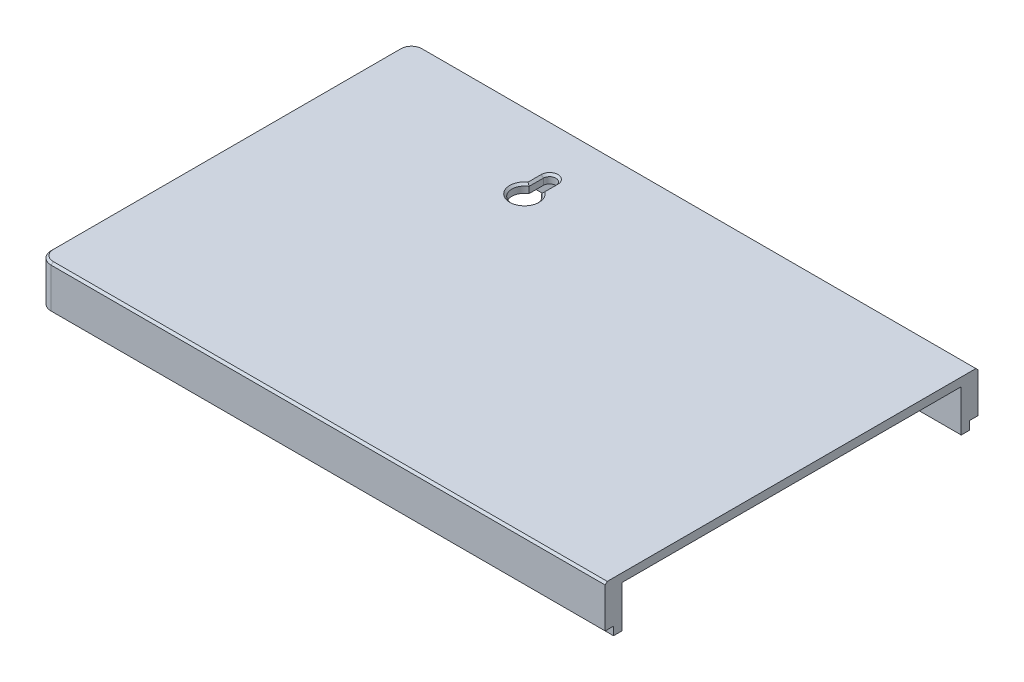
ISO-10303-21;
HEADER;
FILE_DESCRIPTION(('STEP AP214'),'2;1');
FILE_NAME('part.step','',(''),(''),'','','');
FILE_SCHEMA(('AUTOMOTIVE_DESIGN { 1 0 10303 214 1 1 1 1 }'));
ENDSEC;
DATA;
#1=APPLICATION_CONTEXT('core data for automotive mechanical design processes');
#2=APPLICATION_PROTOCOL_DEFINITION('international standard','automotive_design',2000,#1);
#3=PRODUCT_CONTEXT('',#1,'mechanical');
#4=PRODUCT('Part','Part','',(#3));
#5=PRODUCT_RELATED_PRODUCT_CATEGORY('part','',(#4));
#6=PRODUCT_DEFINITION_FORMATION('','',#4);
#7=PRODUCT_DEFINITION_CONTEXT('part definition',#1,'design');
#8=PRODUCT_DEFINITION('design','',#6,#7);
#9=PRODUCT_DEFINITION_SHAPE('','',#8);
#10=(LENGTH_UNIT() NAMED_UNIT(*) SI_UNIT(.MILLI.,.METRE.));
#11=(NAMED_UNIT(*) PLANE_ANGLE_UNIT() SI_UNIT($,.RADIAN.));
#12=(NAMED_UNIT(*) SI_UNIT($,.STERADIAN.) SOLID_ANGLE_UNIT());
#13=UNCERTAINTY_MEASURE_WITH_UNIT(LENGTH_MEASURE(1.E-05),#10,'distance_accuracy_value','');
#14=(GEOMETRIC_REPRESENTATION_CONTEXT(3) GLOBAL_UNCERTAINTY_ASSIGNED_CONTEXT((#13)) GLOBAL_UNIT_ASSIGNED_CONTEXT((#10,
#11,#12)) REPRESENTATION_CONTEXT('',''));
#15=CARTESIAN_POINT('',(0.,0.,0.));
#16=DIRECTION('',(0.,0.,1.));
#17=DIRECTION('',(1.,0.,0.));
#18=AXIS2_PLACEMENT_3D('',#15,#16,#17);
#19=CARTESIAN_POINT('',(-163.25,10.,42.5));
#20=DIRECTION('',(0.,0.,-1.));
#21=DIRECTION('',(-1.,0.,0.));
#22=AXIS2_PLACEMENT_3D('',#19,#20,#21);
#23=PLANE('',#22);
#24=DIRECTION('',(1.,0.,0.));
#25=VECTOR('',#24,1.);
#26=CARTESIAN_POINT('',(-163.25,0.,42.5));
#27=LINE('',#26,#25);
#28=CARTESIAN_POINT('',(-161.25,0.,42.5));
#29=VERTEX_POINT('',#28);
#30=CARTESIAN_POINT('',(-30.0054714408186,0.,42.5));
#31=VERTEX_POINT('',#30);
#32=EDGE_CURVE('E258',#29,#31,#27,.T.);
#33=ORIENTED_EDGE('',*,*,#32,.T.);
#34=DIRECTION('',(0.,1.,0.));
#35=VECTOR('',#34,1.);
#36=CARTESIAN_POINT('',(-30.0054714408186,10.,42.5));
#37=LINE('',#36,#35);
#38=CARTESIAN_POINT('',(-30.0054714408186,2.,42.5));
#39=VERTEX_POINT('',#38);
#40=EDGE_CURVE('E660',#31,#39,#37,.T.);
#41=ORIENTED_EDGE('',*,*,#40,.T.);
#42=DIRECTION('',(1.,0.,0.));
#43=VECTOR('',#42,1.);
#44=CARTESIAN_POINT('',(-163.25,2.,42.5));
#45=LINE('',#44,#43);
#46=CARTESIAN_POINT('',(-161.25,2.,42.5));
#47=VERTEX_POINT('',#46);
#48=EDGE_CURVE('E501',#47,#39,#45,.T.);
#49=ORIENTED_EDGE('',*,*,#48,.F.);
#50=DIRECTION('',(0.,-1.,0.));
#51=VECTOR('',#50,1.);
#52=CARTESIAN_POINT('',(-161.25,10.,42.5));
#53=LINE('',#52,#51);
#54=EDGE_CURVE('E312',#47,#29,#53,.T.);
#55=ORIENTED_EDGE('',*,*,#54,.T.);
#56=EDGE_LOOP('',(#33,#41,#49,#55));
#57=FACE_BOUND('',#56,.T.);
#58=ADVANCED_FACE('F43',(#57),#23,.F.);
#59=CARTESIAN_POINT('',(-163.25,10.,-42.5));
#60=DIRECTION('',(0.,0.,1.));
#61=DIRECTION('',(1.,0.,0.));
#62=AXIS2_PLACEMENT_3D('',#59,#60,#61);
#63=PLANE('',#62);
#64=DIRECTION('',(-1.,0.,0.));
#65=VECTOR('',#64,1.);
#66=CARTESIAN_POINT('',(-163.25,2.,-42.5));
#67=LINE('',#66,#65);
#68=CARTESIAN_POINT('',(-30.0054714408186,2.,-42.5));
#69=VERTEX_POINT('',#68);
#70=CARTESIAN_POINT('',(-161.25,2.,-42.5));
#71=VERTEX_POINT('',#70);
#72=EDGE_CURVE('E242',#69,#71,#67,.T.);
#73=ORIENTED_EDGE('',*,*,#72,.F.);
#74=DIRECTION('',(0.,-1.,0.));
#75=VECTOR('',#74,1.);
#76=CARTESIAN_POINT('',(-30.0054714408186,10.,-42.5));
#77=LINE('',#76,#75);
#78=CARTESIAN_POINT('',(-30.0054714408186,0.,-42.5));
#79=VERTEX_POINT('',#78);
#80=EDGE_CURVE('E225',#69,#79,#77,.T.);
#81=ORIENTED_EDGE('',*,*,#80,.T.);
#82=DIRECTION('',(-1.,0.,0.));
#83=VECTOR('',#82,1.);
#84=CARTESIAN_POINT('',(-163.25,0.,-42.5));
#85=LINE('',#84,#83);
#86=CARTESIAN_POINT('',(-161.25,0.,-42.5));
#87=VERTEX_POINT('',#86);
#88=EDGE_CURVE('E240',#79,#87,#85,.T.);
#89=ORIENTED_EDGE('',*,*,#88,.T.);
#90=DIRECTION('',(0.,-1.,0.));
#91=VECTOR('',#90,1.);
#92=CARTESIAN_POINT('',(-161.25,10.,-42.5));
#93=LINE('',#92,#91);
#94=EDGE_CURVE('E309',#87,#71,#93,.F.);
#95=ORIENTED_EDGE('',*,*,#94,.T.);
#96=EDGE_LOOP('',(#73,#81,#89,#95));
#97=FACE_BOUND('',#96,.T.);
#98=ADVANCED_FACE('F238',(#97),#63,.F.);
#99=CARTESIAN_POINT('',(-163.25,10.,-42.5));
#100=DIRECTION('',(1.,0.,0.));
#101=DIRECTION('',(0.,0.,-1.));
#102=AXIS2_PLACEMENT_3D('',#99,#100,#101);
#103=PLANE('',#102);
#104=DIRECTION('',(0.,0.,1.));
#105=VECTOR('',#104,1.);
#106=CARTESIAN_POINT('',(-163.25,2.,-42.5));
#107=LINE('',#106,#105);
#108=CARTESIAN_POINT('',(-163.25,2.,-40.5));
#109=VERTEX_POINT('',#108);
#110=CARTESIAN_POINT('',(-163.25,2.,40.5));
#111=VERTEX_POINT('',#110);
#112=EDGE_CURVE('E505',#109,#111,#107,.T.);
#113=ORIENTED_EDGE('',*,*,#112,.F.);
#114=DIRECTION('',(0.,-1.,0.));
#115=VECTOR('',#114,1.);
#116=CARTESIAN_POINT('',(-163.25,10.,-40.5));
#117=LINE('',#116,#115);
#118=CARTESIAN_POINT('',(-163.25,0.,-40.5));
#119=VERTEX_POINT('',#118);
#120=EDGE_CURVE('E300',#109,#119,#117,.T.);
#121=ORIENTED_EDGE('',*,*,#120,.T.);
#122=DIRECTION('',(0.,0.,1.));
#123=VECTOR('',#122,1.);
#124=CARTESIAN_POINT('',(-163.25,0.,-42.5));
#125=LINE('',#124,#123);
#126=CARTESIAN_POINT('',(-163.25,0.,40.5));
#127=VERTEX_POINT('',#126);
#128=EDGE_CURVE('E252',#119,#127,#125,.T.);
#129=ORIENTED_EDGE('',*,*,#128,.T.);
#130=DIRECTION('',(0.,-1.,0.));
#131=VECTOR('',#130,1.);
#132=CARTESIAN_POINT('',(-163.25,10.,40.5));
#133=LINE('',#132,#131);
#134=EDGE_CURVE('E297',#127,#111,#133,.F.);
#135=ORIENTED_EDGE('',*,*,#134,.T.);
#136=EDGE_LOOP('',(#113,#121,#129,#135));
#137=FACE_BOUND('',#136,.T.);
#138=ADVANCED_FACE('F588',(#137),#103,.F.);
#139=CARTESIAN_POINT('',(0.,0.,0.));
#140=DIRECTION('',(0.,1.,0.));
#141=DIRECTION('',(0.,0.,1.));
#142=AXIS2_PLACEMENT_3D('',#139,#140,#141);
#143=PLANE('',#142);
#144=ORIENTED_EDGE('',*,*,#88,.F.);
#145=DIRECTION('',(0.,0.,1.));
#146=VECTOR('',#145,1.);
#147=CARTESIAN_POINT('',(-30.0054714408186,0.,-62.2613570422331));
#148=LINE('',#147,#146);
#149=CARTESIAN_POINT('',(-30.0054714408186,0.,-40.5));
#150=VERTEX_POINT('',#149);
#151=EDGE_CURVE('E222',#79,#150,#148,.T.);
#152=ORIENTED_EDGE('',*,*,#151,.T.);
#153=DIRECTION('',(-1.,0.,0.));
#154=VECTOR('',#153,1.);
#155=CARTESIAN_POINT('',(-161.25,0.,-40.5));
#156=LINE('',#155,#154);
#157=CARTESIAN_POINT('',(-158.25,0.,-40.5));
#158=VERTEX_POINT('',#157);
#159=EDGE_CURVE('E511',#150,#158,#156,.T.);
#160=ORIENTED_EDGE('',*,*,#159,.T.);
#161=CARTESIAN_POINT('',(-158.25,0.,-37.5));
#162=DIRECTION('',(0.,1.,0.));
#163=DIRECTION('',(0.,0.,1.));
#164=AXIS2_PLACEMENT_3D('',#161,#162,#163);
#165=CIRCLE('',#164,3.);
#166=CARTESIAN_POINT('',(-161.25,0.,-37.5));
#167=VERTEX_POINT('',#166);
#168=EDGE_CURVE('E291',#158,#167,#165,.T.);
#169=ORIENTED_EDGE('',*,*,#168,.T.);
#170=DIRECTION('',(0.,0.,1.));
#171=VECTOR('',#170,1.);
#172=CARTESIAN_POINT('',(-161.25,0.,-40.5));
#173=LINE('',#172,#171);
#174=CARTESIAN_POINT('',(-161.25,0.,37.5));
#175=VERTEX_POINT('',#174);
#176=EDGE_CURVE('E519',#167,#175,#173,.T.);
#177=ORIENTED_EDGE('',*,*,#176,.T.);
#178=CARTESIAN_POINT('',(-158.25,0.,37.5));
#179=DIRECTION('',(0.,1.,0.));
#180=DIRECTION('',(0.,0.,1.));
#181=AXIS2_PLACEMENT_3D('',#178,#179,#180);
#182=CIRCLE('',#181,3.);
#183=CARTESIAN_POINT('',(-158.25,0.,40.5));
#184=VERTEX_POINT('',#183);
#185=EDGE_CURVE('E294',#175,#184,#182,.T.);
#186=ORIENTED_EDGE('',*,*,#185,.T.);
#187=DIRECTION('',(1.,0.,0.));
#188=VECTOR('',#187,1.);
#189=CARTESIAN_POINT('',(-161.25,0.,40.5));
#190=LINE('',#189,#188);
#191=CARTESIAN_POINT('',(-30.0054714408186,0.,40.5));
#192=VERTEX_POINT('',#191);
#193=EDGE_CURVE('E264',#184,#192,#190,.T.);
#194=ORIENTED_EDGE('',*,*,#193,.T.);
#195=EDGE_CURVE('E234',#192,#31,#148,.T.);
#196=ORIENTED_EDGE('',*,*,#195,.T.);
#197=ORIENTED_EDGE('',*,*,#32,.F.);
#198=CARTESIAN_POINT('',(-161.25,0.,40.5));
#199=DIRECTION('',(0.,1.,0.));
#200=DIRECTION('',(0.,0.,1.));
#201=AXIS2_PLACEMENT_3D('',#198,#199,#200);
#202=CIRCLE('',#201,2.);
#203=EDGE_CURVE('E304',#29,#127,#202,.F.);
#204=ORIENTED_EDGE('',*,*,#203,.T.);
#205=ORIENTED_EDGE('',*,*,#128,.F.);
#206=CARTESIAN_POINT('',(-161.25,0.,-40.5));
#207=DIRECTION('',(0.,1.,0.));
#208=DIRECTION('',(0.,0.,1.));
#209=AXIS2_PLACEMENT_3D('',#206,#207,#208);
#210=CIRCLE('',#209,2.);
#211=EDGE_CURVE('E249',#119,#87,#210,.F.);
#212=ORIENTED_EDGE('',*,*,#211,.T.);
#213=EDGE_LOOP('',(#144,#152,#160,#169,#177,#186,#194,#196,#197,#204,#205,#212));
#214=FACE_BOUND('',#213,.T.);
#215=ADVANCED_FACE('F247',(#214),#143,.F.);
#216=CARTESIAN_POINT('',(-161.25,10.,-40.5));
#217=DIRECTION('',(0.,0.,1.));
#218=DIRECTION('',(1.,0.,0.));
#219=AXIS2_PLACEMENT_3D('',#216,#217,#218);
#220=PLANE('',#219);
#221=DIRECTION('',(0.,-1.,0.));
#222=VECTOR('',#221,1.);
#223=CARTESIAN_POINT('',(-30.0054714408186,10.,-40.5));
#224=LINE('',#223,#222);
#225=CARTESIAN_POINT('',(-30.0054714408186,10.,-40.5));
#226=VERTEX_POINT('',#225);
#227=EDGE_CURVE('E228',#226,#150,#224,.T.);
#228=ORIENTED_EDGE('',*,*,#227,.F.);
#229=DIRECTION('',(-1.,0.,0.));
#230=VECTOR('',#229,1.);
#231=CARTESIAN_POINT('',(-161.25,10.,-40.5));
#232=LINE('',#231,#230);
#233=CARTESIAN_POINT('',(-158.25,10.,-40.5));
#234=VERTEX_POINT('',#233);
#235=EDGE_CURVE('E512',#226,#234,#232,.T.);
#236=ORIENTED_EDGE('',*,*,#235,.T.);
#237=DIRECTION('',(0.,-1.,0.));
#238=VECTOR('',#237,1.);
#239=CARTESIAN_POINT('',(-158.25,0.,-40.5));
#240=LINE('',#239,#238);
#241=EDGE_CURVE('E270',#234,#158,#240,.T.);
#242=ORIENTED_EDGE('',*,*,#241,.T.);
#243=ORIENTED_EDGE('',*,*,#159,.F.);
#244=EDGE_LOOP('',(#228,#236,#242,#243));
#245=FACE_BOUND('',#244,.T.);
#246=ADVANCED_FACE('F552',(#245),#220,.T.);
#247=CARTESIAN_POINT('',(-161.25,10.,-40.5));
#248=DIRECTION('',(1.,0.,0.));
#249=DIRECTION('',(0.,0.,-1.));
#250=AXIS2_PLACEMENT_3D('',#247,#248,#249);
#251=PLANE('',#250);
#252=ORIENTED_EDGE('',*,*,#176,.F.);
#253=DIRECTION('',(0.,-1.,0.));
#254=VECTOR('',#253,1.);
#255=CARTESIAN_POINT('',(-161.25,10.,-37.5));
#256=LINE('',#255,#254);
#257=CARTESIAN_POINT('',(-161.25,10.,-37.5));
#258=VERTEX_POINT('',#257);
#259=EDGE_CURVE('E278',#167,#258,#256,.F.);
#260=ORIENTED_EDGE('',*,*,#259,.T.);
#261=DIRECTION('',(0.,0.,1.));
#262=VECTOR('',#261,1.);
#263=CARTESIAN_POINT('',(-161.25,10.,-40.5));
#264=LINE('',#263,#262);
#265=CARTESIAN_POINT('',(-161.25,10.,37.5));
#266=VERTEX_POINT('',#265);
#267=EDGE_CURVE('E261',#258,#266,#264,.T.);
#268=ORIENTED_EDGE('',*,*,#267,.T.);
#269=DIRECTION('',(0.,-1.,0.));
#270=VECTOR('',#269,1.);
#271=CARTESIAN_POINT('',(-161.25,0.,37.5));
#272=LINE('',#271,#270);
#273=EDGE_CURVE('E274',#266,#175,#272,.T.);
#274=ORIENTED_EDGE('',*,*,#273,.T.);
#275=EDGE_LOOP('',(#252,#260,#268,#274));
#276=FACE_BOUND('',#275,.T.);
#277=ADVANCED_FACE('F545',(#276),#251,.T.);
#278=CARTESIAN_POINT('',(-161.25,10.,40.5));
#279=DIRECTION('',(0.,0.,-1.));
#280=DIRECTION('',(-1.,0.,0.));
#281=AXIS2_PLACEMENT_3D('',#278,#279,#280);
#282=PLANE('',#281);
#283=DIRECTION('',(0.,1.,0.));
#284=VECTOR('',#283,1.);
#285=CARTESIAN_POINT('',(-30.0054714408186,10.,40.5));
#286=LINE('',#285,#284);
#287=CARTESIAN_POINT('',(-30.0054714408186,10.,40.5));
#288=VERTEX_POINT('',#287);
#289=EDGE_CURVE('E533',#192,#288,#286,.T.);
#290=ORIENTED_EDGE('',*,*,#289,.F.);
#291=ORIENTED_EDGE('',*,*,#193,.F.);
#292=DIRECTION('',(0.,-1.,0.));
#293=VECTOR('',#292,1.);
#294=CARTESIAN_POINT('',(-158.25,10.,40.5));
#295=LINE('',#294,#293);
#296=CARTESIAN_POINT('',(-158.25,10.,40.5));
#297=VERTEX_POINT('',#296);
#298=EDGE_CURVE('E288',#184,#297,#295,.F.);
#299=ORIENTED_EDGE('',*,*,#298,.T.);
#300=DIRECTION('',(1.,0.,0.));
#301=VECTOR('',#300,1.);
#302=CARTESIAN_POINT('',(-161.25,10.,40.5));
#303=LINE('',#302,#301);
#304=EDGE_CURVE('E253',#297,#288,#303,.T.);
#305=ORIENTED_EDGE('',*,*,#304,.T.);
#306=EDGE_LOOP('',(#290,#291,#299,#305));
#307=FACE_BOUND('',#306,.T.);
#308=ADVANCED_FACE('F531',(#307),#282,.T.);
#309=CARTESIAN_POINT('',(0.,2.,0.));
#310=DIRECTION('',(0.,1.,0.));
#311=DIRECTION('',(0.,0.,1.));
#312=AXIS2_PLACEMENT_3D('',#309,#310,#311);
#313=PLANE('',#312);
#314=DIRECTION('',(-1.,0.,0.));
#315=VECTOR('',#314,1.);
#316=CARTESIAN_POINT('',(-165.25,2.,-44.5));
#317=LINE('',#316,#315);
#318=CARTESIAN_POINT('',(-30.0054714408186,2.,-44.5));
#319=VERTEX_POINT('',#318);
#320=CARTESIAN_POINT('',(-162.25,2.,-44.5));
#321=VERTEX_POINT('',#320);
#322=EDGE_CURVE('E393',#319,#321,#317,.T.);
#323=ORIENTED_EDGE('',*,*,#322,.F.);
#324=DIRECTION('',(0.,0.,1.));
#325=VECTOR('',#324,1.);
#326=CARTESIAN_POINT('',(-30.0054714408186,2.,0.));
#327=LINE('',#326,#325);
#328=EDGE_CURVE('E245',#319,#69,#327,.T.);
#329=ORIENTED_EDGE('',*,*,#328,.T.);
#330=ORIENTED_EDGE('',*,*,#72,.T.);
#331=CARTESIAN_POINT('',(-161.25,2.,-40.5));
#332=DIRECTION('',(0.,1.,0.));
#333=DIRECTION('',(0.,0.,1.));
#334=AXIS2_PLACEMENT_3D('',#331,#332,#333);
#335=CIRCLE('',#334,2.);
#336=EDGE_CURVE('E316',#71,#109,#335,.T.);
#337=ORIENTED_EDGE('',*,*,#336,.T.);
#338=ORIENTED_EDGE('',*,*,#112,.T.);
#339=CARTESIAN_POINT('',(-161.25,2.,40.5));
#340=DIRECTION('',(0.,1.,0.));
#341=DIRECTION('',(0.,0.,1.));
#342=AXIS2_PLACEMENT_3D('',#339,#340,#341);
#343=CIRCLE('',#342,2.);
#344=EDGE_CURVE('E319',#111,#47,#343,.T.);
#345=ORIENTED_EDGE('',*,*,#344,.T.);
#346=ORIENTED_EDGE('',*,*,#48,.T.);
#347=CARTESIAN_POINT('',(-30.0054714408186,2.,44.5));
#348=VERTEX_POINT('',#347);
#349=EDGE_CURVE('E685',#39,#348,#327,.T.);
#350=ORIENTED_EDGE('',*,*,#349,.T.);
#351=DIRECTION('',(1.,0.,0.));
#352=VECTOR('',#351,1.);
#353=CARTESIAN_POINT('',(-165.25,2.,44.5));
#354=LINE('',#353,#352);
#355=CARTESIAN_POINT('',(-162.25,2.,44.5));
#356=VERTEX_POINT('',#355);
#357=EDGE_CURVE('E497',#356,#348,#354,.T.);
#358=ORIENTED_EDGE('',*,*,#357,.F.);
#359=CARTESIAN_POINT('',(-162.25,2.,41.5));
#360=DIRECTION('',(0.,1.,0.));
#361=DIRECTION('',(0.,0.,1.));
#362=AXIS2_PLACEMENT_3D('',#359,#360,#361);
#363=CIRCLE('',#362,3.);
#364=CARTESIAN_POINT('',(-165.25,2.,41.5));
#365=VERTEX_POINT('',#364);
#366=EDGE_CURVE('E330',#356,#365,#363,.F.);
#367=ORIENTED_EDGE('',*,*,#366,.T.);
#368=DIRECTION('',(0.,0.,1.));
#369=VECTOR('',#368,1.);
#370=CARTESIAN_POINT('',(-165.25,2.,-44.5));
#371=LINE('',#370,#369);
#372=CARTESIAN_POINT('',(-165.25,2.,-41.5));
#373=VERTEX_POINT('',#372);
#374=EDGE_CURVE('E493',#373,#365,#371,.T.);
#375=ORIENTED_EDGE('',*,*,#374,.F.);
#376=CARTESIAN_POINT('',(-162.25,2.,-41.5));
#377=DIRECTION('',(0.,1.,0.));
#378=DIRECTION('',(0.,0.,1.));
#379=AXIS2_PLACEMENT_3D('',#376,#377,#378);
#380=CIRCLE('',#379,3.);
#381=EDGE_CURVE('E326',#373,#321,#380,.F.);
#382=ORIENTED_EDGE('',*,*,#381,.T.);
#383=EDGE_LOOP('',(#323,#329,#330,#337,#338,#345,#346,#350,#358,#367,#375,#382));
#384=FACE_BOUND('',#383,.T.);
#385=ADVANCED_FACE('F696',(#384),#313,.F.);
#386=CARTESIAN_POINT('',(-165.25,2.,44.5));
#387=DIRECTION('',(0.,0.,1.));
#388=DIRECTION('',(1.,0.,0.));
#389=AXIS2_PLACEMENT_3D('',#386,#387,#388);
#390=PLANE('',#389);
#391=DIRECTION('',(0.,-1.,0.));
#392=VECTOR('',#391,1.);
#393=CARTESIAN_POINT('',(-30.0054714408186,2.,44.5));
#394=LINE('',#393,#392);
#395=CARTESIAN_POINT('',(-30.0054714408186,11.5,44.5));
#396=VERTEX_POINT('',#395);
#397=EDGE_CURVE('E233',#396,#348,#394,.T.);
#398=ORIENTED_EDGE('',*,*,#397,.F.);
#399=DIRECTION('',(-1.,0.,0.));
#400=VECTOR('',#399,1.);
#401=CARTESIAN_POINT('',(-165.25,11.5,44.5));
#402=LINE('',#401,#400);
#403=CARTESIAN_POINT('',(-162.25,11.5,44.5));
#404=VERTEX_POINT('',#403);
#405=EDGE_CURVE('E359',#396,#404,#402,.T.);
#406=ORIENTED_EDGE('',*,*,#405,.T.);
#407=DIRECTION('',(0.,1.,0.));
#408=VECTOR('',#407,1.);
#409=CARTESIAN_POINT('',(-162.25,2.,44.5));
#410=LINE('',#409,#408);
#411=EDGE_CURVE('E333',#404,#356,#410,.F.);
#412=ORIENTED_EDGE('',*,*,#411,.T.);
#413=ORIENTED_EDGE('',*,*,#357,.T.);
#414=EDGE_LOOP('',(#398,#406,#412,#413));
#415=FACE_BOUND('',#414,.T.);
#416=ADVANCED_FACE('F708',(#415),#390,.T.);
#417=CARTESIAN_POINT('',(-165.25,2.,-44.5));
#418=DIRECTION('',(-1.,0.,0.));
#419=DIRECTION('',(0.,0.,1.));
#420=AXIS2_PLACEMENT_3D('',#417,#418,#419);
#421=PLANE('',#420);
#422=DIRECTION('',(0.,1.,0.));
#423=VECTOR('',#422,1.);
#424=CARTESIAN_POINT('',(-165.25,2.,41.5));
#425=LINE('',#424,#423);
#426=CARTESIAN_POINT('',(-165.25,11.5,41.5));
#427=VERTEX_POINT('',#426);
#428=EDGE_CURVE('E339',#365,#427,#425,.T.);
#429=ORIENTED_EDGE('',*,*,#428,.T.);
#430=DIRECTION('',(0.,0.,-1.));
#431=VECTOR('',#430,1.);
#432=CARTESIAN_POINT('',(-165.25,11.5,-44.5));
#433=LINE('',#432,#431);
#434=CARTESIAN_POINT('',(-165.25,11.5,-41.5));
#435=VERTEX_POINT('',#434);
#436=EDGE_CURVE('E365',#427,#435,#433,.T.);
#437=ORIENTED_EDGE('',*,*,#436,.T.);
#438=DIRECTION('',(0.,1.,0.));
#439=VECTOR('',#438,1.);
#440=CARTESIAN_POINT('',(-165.25,2.,-41.5));
#441=LINE('',#440,#439);
#442=EDGE_CURVE('E336',#435,#373,#441,.F.);
#443=ORIENTED_EDGE('',*,*,#442,.T.);
#444=ORIENTED_EDGE('',*,*,#374,.T.);
#445=EDGE_LOOP('',(#429,#437,#443,#444));
#446=FACE_BOUND('',#445,.T.);
#447=ADVANCED_FACE('F702',(#446),#421,.T.);
#448=CARTESIAN_POINT('',(-165.25,2.,-44.5));
#449=DIRECTION('',(0.,0.,-1.));
#450=DIRECTION('',(-1.,0.,0.));
#451=AXIS2_PLACEMENT_3D('',#448,#449,#450);
#452=PLANE('',#451);
#453=DIRECTION('',(0.,1.,0.));
#454=VECTOR('',#453,1.);
#455=CARTESIAN_POINT('',(-30.0054714408186,2.,-44.5));
#456=LINE('',#455,#454);
#457=CARTESIAN_POINT('',(-30.0054714408186,11.5,-44.5));
#458=VERTEX_POINT('',#457);
#459=EDGE_CURVE('E659',#319,#458,#456,.T.);
#460=ORIENTED_EDGE('',*,*,#459,.F.);
#461=ORIENTED_EDGE('',*,*,#322,.T.);
#462=DIRECTION('',(0.,1.,0.));
#463=VECTOR('',#462,1.);
#464=CARTESIAN_POINT('',(-162.25,2.,-44.5));
#465=LINE('',#464,#463);
#466=CARTESIAN_POINT('',(-162.25,11.5,-44.5));
#467=VERTEX_POINT('',#466);
#468=EDGE_CURVE('E322',#321,#467,#465,.T.);
#469=ORIENTED_EDGE('',*,*,#468,.T.);
#470=DIRECTION('',(1.,0.,0.));
#471=VECTOR('',#470,1.);
#472=CARTESIAN_POINT('',(-165.25,11.5,-44.5));
#473=LINE('',#472,#471);
#474=EDGE_CURVE('E371',#467,#458,#473,.T.);
#475=ORIENTED_EDGE('',*,*,#474,.T.);
#476=EDGE_LOOP('',(#460,#461,#469,#475));
#477=FACE_BOUND('',#476,.T.);
#478=ADVANCED_FACE('F664',(#477),#452,.T.);
#479=CARTESIAN_POINT('',(0.,10.,0.));
#480=DIRECTION('',(0.,1.,0.));
#481=DIRECTION('',(0.,0.,1.));
#482=AXIS2_PLACEMENT_3D('',#479,#480,#481);
#483=PLANE('',#482);
#484=DIRECTION('',(0.,0.,-1.));
#485=VECTOR('',#484,1.);
#486=CARTESIAN_POINT('',(-118.5,10.,0.));
#487=LINE('',#486,#485);
#488=CARTESIAN_POINT('',(-118.5,10.,-28.8207632967525));
#489=VERTEX_POINT('',#488);
#490=CARTESIAN_POINT('',(-118.5,10.,-32.2226870853992));
#491=VERTEX_POINT('',#490);
#492=EDGE_CURVE('E484',#489,#491,#487,.T.);
#493=ORIENTED_EDGE('',*,*,#492,.T.);
#494=CARTESIAN_POINT('',(-120.,10.,-32.2226870853992));
#495=DIRECTION('',(0.,1.,0.));
#496=DIRECTION('',(0.,0.,1.));
#497=AXIS2_PLACEMENT_3D('',#494,#495,#496);
#498=CIRCLE('',#497,1.5);
#499=CARTESIAN_POINT('',(-121.5,10.,-32.2226870853992));
#500=VERTEX_POINT('',#499);
#501=EDGE_CURVE('E381',#491,#500,#498,.T.);
#502=ORIENTED_EDGE('',*,*,#501,.T.);
#503=DIRECTION('',(0.,0.,1.));
#504=VECTOR('',#503,1.);
#505=CARTESIAN_POINT('',(-121.5,10.,0.));
#506=LINE('',#505,#504);
#507=CARTESIAN_POINT('',(-121.5,10.,-28.8207632967525));
#508=VERTEX_POINT('',#507);
#509=EDGE_CURVE('E475',#500,#508,#506,.T.);
#510=ORIENTED_EDGE('',*,*,#509,.T.);
#511=CARTESIAN_POINT('',(-120.,10.,-26.2226870853992));
#512=DIRECTION('',(0.,1.,0.));
#513=DIRECTION('',(0.,0.,1.));
#514=AXIS2_PLACEMENT_3D('',#511,#512,#513);
#515=CIRCLE('',#514,3.00000000000001);
#516=EDGE_CURVE('E479',#508,#489,#515,.T.);
#517=ORIENTED_EDGE('',*,*,#516,.T.);
#518=EDGE_LOOP('',(#493,#502,#510,#517));
#519=FACE_BOUND('',#518,.T.);
#520=ORIENTED_EDGE('',*,*,#235,.F.);
#521=DIRECTION('',(0.,0.,1.));
#522=VECTOR('',#521,1.);
#523=CARTESIAN_POINT('',(-30.0054714408186,10.,0.));
#524=LINE('',#523,#522);
#525=EDGE_CURVE('E244',#226,#288,#524,.T.);
#526=ORIENTED_EDGE('',*,*,#525,.T.);
#527=ORIENTED_EDGE('',*,*,#304,.F.);
#528=CARTESIAN_POINT('',(-158.25,10.,37.5));
#529=DIRECTION('',(0.,1.,0.));
#530=DIRECTION('',(0.,0.,1.));
#531=AXIS2_PLACEMENT_3D('',#528,#529,#530);
#532=CIRCLE('',#531,3.);
#533=EDGE_CURVE('E281',#297,#266,#532,.F.);
#534=ORIENTED_EDGE('',*,*,#533,.T.);
#535=ORIENTED_EDGE('',*,*,#267,.F.);
#536=CARTESIAN_POINT('',(-158.25,10.,-37.5));
#537=DIRECTION('',(0.,1.,0.));
#538=DIRECTION('',(0.,0.,1.));
#539=AXIS2_PLACEMENT_3D('',#536,#537,#538);
#540=CIRCLE('',#539,3.);
#541=EDGE_CURVE('E284',#258,#234,#540,.F.);
#542=ORIENTED_EDGE('',*,*,#541,.T.);
#543=EDGE_LOOP('',(#520,#526,#527,#534,#535,#542));
#544=FACE_BOUND('',#543,.T.);
#545=ADVANCED_FACE('F541',(#519,#544),#483,.F.);
#546=CARTESIAN_POINT('',(0.,12.,0.));
#547=DIRECTION('',(0.,1.,0.));
#548=DIRECTION('',(0.,0.,1.));
#549=AXIS2_PLACEMENT_3D('',#546,#547,#548);
#550=PLANE('',#549);
#551=DIRECTION('',(0.,0.,1.));
#552=VECTOR('',#551,1.);
#553=CARTESIAN_POINT('',(-30.0054714408186,12.,-62.2613570422331));
#554=LINE('',#553,#552);
#555=CARTESIAN_POINT('',(-30.0054714408186,12.,-44.));
#556=VERTEX_POINT('',#555);
#557=CARTESIAN_POINT('',(-30.0054714408186,12.,44.));
#558=VERTEX_POINT('',#557);
#559=EDGE_CURVE('E59',#556,#558,#554,.T.);
#560=ORIENTED_EDGE('',*,*,#559,.F.);
#561=DIRECTION('',(-1.,0.,0.));
#562=VECTOR('',#561,1.);
#563=CARTESIAN_POINT('',(0.,12.,-44.));
#564=LINE('',#563,#562);
#565=CARTESIAN_POINT('',(-162.25,12.,-44.));
#566=VERTEX_POINT('',#565);
#567=EDGE_CURVE('E343',#556,#566,#564,.T.);
#568=ORIENTED_EDGE('',*,*,#567,.T.);
#569=CARTESIAN_POINT('',(-162.25,12.,-41.5));
#570=DIRECTION('',(0.,1.,0.));
#571=DIRECTION('',(0.,0.,1.));
#572=AXIS2_PLACEMENT_3D('',#569,#570,#571);
#573=CIRCLE('',#572,2.49999999999997);
#574=CARTESIAN_POINT('',(-164.75,12.,-41.5));
#575=VERTEX_POINT('',#574);
#576=EDGE_CURVE('E346',#566,#575,#573,.T.);
#577=ORIENTED_EDGE('',*,*,#576,.T.);
#578=DIRECTION('',(0.,0.,1.));
#579=VECTOR('',#578,1.);
#580=CARTESIAN_POINT('',(-164.75,12.,0.));
#581=LINE('',#580,#579);
#582=CARTESIAN_POINT('',(-164.75,12.,41.5));
#583=VERTEX_POINT('',#582);
#584=EDGE_CURVE('E349',#575,#583,#581,.T.);
#585=ORIENTED_EDGE('',*,*,#584,.T.);
#586=CARTESIAN_POINT('',(-162.25,12.,41.5));
#587=DIRECTION('',(0.,1.,0.));
#588=DIRECTION('',(0.,0.,1.));
#589=AXIS2_PLACEMENT_3D('',#586,#587,#588);
#590=CIRCLE('',#589,2.49999999999997);
#591=CARTESIAN_POINT('',(-162.25,12.,44.));
#592=VERTEX_POINT('',#591);
#593=EDGE_CURVE('E352',#583,#592,#590,.T.);
#594=ORIENTED_EDGE('',*,*,#593,.T.);
#595=DIRECTION('',(1.,0.,0.));
#596=VECTOR('',#595,1.);
#597=CARTESIAN_POINT('',(0.,12.,44.));
#598=LINE('',#597,#596);
#599=EDGE_CURVE('E355',#592,#558,#598,.T.);
#600=ORIENTED_EDGE('',*,*,#599,.T.);
#601=EDGE_LOOP('',(#560,#568,#577,#585,#594,#600));
#602=FACE_BOUND('',#601,.T.);
#603=CARTESIAN_POINT('',(-120.,12.,-26.2226870853992));
#604=DIRECTION('',(0.,1.,0.));
#605=DIRECTION('',(0.,0.,1.));
#606=AXIS2_PLACEMENT_3D('',#603,#604,#605);
#607=CIRCLE('',#606,3.50000000000006);
#608=CARTESIAN_POINT('',(-118.,12.,-29.0949684086682));
#609=VERTEX_POINT('',#608);
#610=CARTESIAN_POINT('',(-122.,12.,-29.0949684086682));
#611=VERTEX_POINT('',#610);
#612=EDGE_CURVE('E375',#609,#611,#607,.F.);
#613=ORIENTED_EDGE('',*,*,#612,.T.);
#614=DIRECTION('',(0.,0.,-1.));
#615=VECTOR('',#614,1.);
#616=CARTESIAN_POINT('',(-122.,12.,-32.2226870853992));
#617=LINE('',#616,#615);
#618=CARTESIAN_POINT('',(-122.,12.,-32.2226870853992));
#619=VERTEX_POINT('',#618);
#620=EDGE_CURVE('E402',#611,#619,#617,.T.);
#621=ORIENTED_EDGE('',*,*,#620,.T.);
#622=CARTESIAN_POINT('',(-120.,12.,-32.2226870853992));
#623=DIRECTION('',(0.,1.,0.));
#624=DIRECTION('',(0.,0.,1.));
#625=AXIS2_PLACEMENT_3D('',#622,#623,#624);
#626=CIRCLE('',#625,2.00000000000006);
#627=CARTESIAN_POINT('',(-118.,12.,-32.2226870853992));
#628=VERTEX_POINT('',#627);
#629=EDGE_CURVE('E399',#619,#628,#626,.F.);
#630=ORIENTED_EDGE('',*,*,#629,.T.);
#631=DIRECTION('',(0.,0.,1.));
#632=VECTOR('',#631,1.);
#633=CARTESIAN_POINT('',(-118.,12.,-28.8207632967525));
#634=LINE('',#633,#632);
#635=EDGE_CURVE('E396',#628,#609,#634,.T.);
#636=ORIENTED_EDGE('',*,*,#635,.T.);
#637=EDGE_LOOP('',(#613,#621,#630,#636));
#638=FACE_BOUND('',#637,.T.);
#639=ADVANCED_FACE('F574',(#602,#638),#550,.T.);
#640=CARTESIAN_POINT('',(-158.25,10.,-37.5));
#641=DIRECTION('',(0.,1.,0.));
#642=DIRECTION('',(0.,0.,1.));
#643=AXIS2_PLACEMENT_3D('',#640,#641,#642);
#644=CYLINDRICAL_SURFACE('',#643,3.);
#645=ORIENTED_EDGE('',*,*,#541,.F.);
#646=ORIENTED_EDGE('',*,*,#259,.F.);
#647=ORIENTED_EDGE('',*,*,#168,.F.);
#648=ORIENTED_EDGE('',*,*,#241,.F.);
#649=EDGE_LOOP('',(#645,#646,#647,#648));
#650=FACE_BOUND('',#649,.T.);
#651=ADVANCED_FACE('F549',(#650),#644,.F.);
#652=CARTESIAN_POINT('',(-158.25,10.,37.5));
#653=DIRECTION('',(0.,1.,0.));
#654=DIRECTION('',(0.,0.,1.));
#655=AXIS2_PLACEMENT_3D('',#652,#653,#654);
#656=CYLINDRICAL_SURFACE('',#655,3.);
#657=ORIENTED_EDGE('',*,*,#533,.F.);
#658=ORIENTED_EDGE('',*,*,#298,.F.);
#659=ORIENTED_EDGE('',*,*,#185,.F.);
#660=ORIENTED_EDGE('',*,*,#273,.F.);
#661=EDGE_LOOP('',(#657,#658,#659,#660));
#662=FACE_BOUND('',#661,.T.);
#663=ADVANCED_FACE('F536',(#662),#656,.F.);
#664=CARTESIAN_POINT('',(-161.25,10.,-40.5));
#665=DIRECTION('',(0.,-1.,0.));
#666=DIRECTION('',(0.,0.,-1.));
#667=AXIS2_PLACEMENT_3D('',#664,#665,#666);
#668=CYLINDRICAL_SURFACE('',#667,2.);
#669=ORIENTED_EDGE('',*,*,#336,.F.);
#670=ORIENTED_EDGE('',*,*,#94,.F.);
#671=ORIENTED_EDGE('',*,*,#211,.F.);
#672=ORIENTED_EDGE('',*,*,#120,.F.);
#673=EDGE_LOOP('',(#669,#670,#671,#672));
#674=FACE_BOUND('',#673,.T.);
#675=ADVANCED_FACE('F600',(#674),#668,.T.);
#676=CARTESIAN_POINT('',(-161.25,10.,40.5));
#677=DIRECTION('',(0.,-1.,0.));
#678=DIRECTION('',(0.,0.,-1.));
#679=AXIS2_PLACEMENT_3D('',#676,#677,#678);
#680=CYLINDRICAL_SURFACE('',#679,2.);
#681=ORIENTED_EDGE('',*,*,#344,.F.);
#682=ORIENTED_EDGE('',*,*,#134,.F.);
#683=ORIENTED_EDGE('',*,*,#203,.F.);
#684=ORIENTED_EDGE('',*,*,#54,.F.);
#685=EDGE_LOOP('',(#681,#682,#683,#684));
#686=FACE_BOUND('',#685,.T.);
#687=ADVANCED_FACE('F603',(#686),#680,.T.);
#688=CARTESIAN_POINT('',(-162.25,2.,41.5));
#689=DIRECTION('',(0.,1.,0.));
#690=DIRECTION('',(0.,0.,1.));
#691=AXIS2_PLACEMENT_3D('',#688,#689,#690);
#692=CYLINDRICAL_SURFACE('',#691,3.);
#693=ORIENTED_EDGE('',*,*,#411,.F.);
#694=CARTESIAN_POINT('',(-162.25,11.5,41.5));
#695=DIRECTION('',(0.,1.,0.));
#696=DIRECTION('',(0.,0.,1.));
#697=AXIS2_PLACEMENT_3D('',#694,#695,#696);
#698=CIRCLE('',#697,3.);
#699=EDGE_CURVE('E362',#404,#427,#698,.F.);
#700=ORIENTED_EDGE('',*,*,#699,.T.);
#701=ORIENTED_EDGE('',*,*,#428,.F.);
#702=ORIENTED_EDGE('',*,*,#366,.F.);
#703=EDGE_LOOP('',(#693,#700,#701,#702));
#704=FACE_BOUND('',#703,.T.);
#705=ADVANCED_FACE('F607',(#704),#692,.T.);
#706=CARTESIAN_POINT('',(-162.25,2.,-41.5));
#707=DIRECTION('',(0.,1.,0.));
#708=DIRECTION('',(0.,0.,1.));
#709=AXIS2_PLACEMENT_3D('',#706,#707,#708);
#710=CYLINDRICAL_SURFACE('',#709,3.);
#711=ORIENTED_EDGE('',*,*,#442,.F.);
#712=CARTESIAN_POINT('',(-162.25,11.5,-41.5));
#713=DIRECTION('',(0.,1.,0.));
#714=DIRECTION('',(0.,0.,1.));
#715=AXIS2_PLACEMENT_3D('',#712,#713,#714);
#716=CIRCLE('',#715,3.);
#717=EDGE_CURVE('E368',#435,#467,#716,.F.);
#718=ORIENTED_EDGE('',*,*,#717,.T.);
#719=ORIENTED_EDGE('',*,*,#468,.F.);
#720=ORIENTED_EDGE('',*,*,#381,.F.);
#721=EDGE_LOOP('',(#711,#718,#719,#720));
#722=FACE_BOUND('',#721,.T.);
#723=ADVANCED_FACE('F611',(#722),#710,.T.);
#724=CARTESIAN_POINT('',(0.,12.,-44.));
#725=DIRECTION('',(0.,-0.707106781186567,0.707106781186528));
#726=DIRECTION('',(-1.,0.,0.));
#727=AXIS2_PLACEMENT_3D('',#724,#725,#726);
#728=PLANE('',#727);
#729=DIRECTION('',(0.,-0.707106781186528,-0.707106781186567));
#730=VECTOR('',#729,1.);
#731=CARTESIAN_POINT('',(-30.0054714408186,12.,-44.));
#732=LINE('',#731,#730);
#733=EDGE_CURVE('E656',#458,#556,#732,.F.);
#734=ORIENTED_EDGE('',*,*,#733,.F.);
#735=ORIENTED_EDGE('',*,*,#474,.F.);
#736=DIRECTION('',(0.,-0.707106781186528,-0.707106781186567));
#737=VECTOR('',#736,1.);
#738=CARTESIAN_POINT('',(-162.25,12.,-44.));
#739=LINE('',#738,#737);
#740=EDGE_CURVE('E389',#566,#467,#739,.T.);
#741=ORIENTED_EDGE('',*,*,#740,.F.);
#742=ORIENTED_EDGE('',*,*,#567,.F.);
#743=EDGE_LOOP('',(#734,#735,#741,#742));
#744=FACE_BOUND('',#743,.T.);
#745=ADVANCED_FACE('F615',(#744),#728,.F.);
#746=CARTESIAN_POINT('',(-162.25,12.,-41.5));
#747=DIRECTION('',(0.,-1.,0.));
#748=DIRECTION('',(0.,0.,-1.));
#749=AXIS2_PLACEMENT_3D('',#746,#747,#748);
#750=CONICAL_SURFACE('',#749,2.49999999999997,0.785398163397473);
#751=ORIENTED_EDGE('',*,*,#740,.T.);
#752=ORIENTED_EDGE('',*,*,#717,.F.);
#753=DIRECTION('',(-0.707106781186567,-0.707106781186528,0.));
#754=VECTOR('',#753,1.);
#755=CARTESIAN_POINT('',(-164.75,12.,-41.5));
#756=LINE('',#755,#754);
#757=EDGE_CURVE('E385',#575,#435,#756,.T.);
#758=ORIENTED_EDGE('',*,*,#757,.F.);
#759=ORIENTED_EDGE('',*,*,#576,.F.);
#760=EDGE_LOOP('',(#751,#752,#758,#759));
#761=FACE_BOUND('',#760,.T.);
#762=ADVANCED_FACE('F639',(#761),#750,.T.);
#763=CARTESIAN_POINT('',(-164.75,12.,0.));
#764=DIRECTION('',(0.707106781186528,-0.707106781186567,0.));
#765=DIRECTION('',(0.,0.,1.));
#766=AXIS2_PLACEMENT_3D('',#763,#764,#765);
#767=PLANE('',#766);
#768=ORIENTED_EDGE('',*,*,#757,.T.);
#769=ORIENTED_EDGE('',*,*,#436,.F.);
#770=DIRECTION('',(-0.707106781186567,-0.707106781186528,0.));
#771=VECTOR('',#770,1.);
#772=CARTESIAN_POINT('',(-164.75,12.,41.5));
#773=LINE('',#772,#771);
#774=EDGE_CURVE('E380',#583,#427,#773,.T.);
#775=ORIENTED_EDGE('',*,*,#774,.F.);
#776=ORIENTED_EDGE('',*,*,#584,.F.);
#777=EDGE_LOOP('',(#768,#769,#775,#776));
#778=FACE_BOUND('',#777,.T.);
#779=ADVANCED_FACE('F632',(#778),#767,.F.);
#780=CARTESIAN_POINT('',(-162.25,12.,41.5));
#781=DIRECTION('',(0.,-1.,0.));
#782=DIRECTION('',(0.,0.,-1.));
#783=AXIS2_PLACEMENT_3D('',#780,#781,#782);
#784=CONICAL_SURFACE('',#783,2.49999999999997,0.785398163397473);
#785=ORIENTED_EDGE('',*,*,#774,.T.);
#786=ORIENTED_EDGE('',*,*,#699,.F.);
#787=DIRECTION('',(0.,-0.707106781186528,0.707106781186567));
#788=VECTOR('',#787,1.);
#789=CARTESIAN_POINT('',(-162.25,12.,44.));
#790=LINE('',#789,#788);
#791=EDGE_CURVE('E376',#592,#404,#790,.T.);
#792=ORIENTED_EDGE('',*,*,#791,.F.);
#793=ORIENTED_EDGE('',*,*,#593,.F.);
#794=EDGE_LOOP('',(#785,#786,#792,#793));
#795=FACE_BOUND('',#794,.T.);
#796=ADVANCED_FACE('F625',(#795),#784,.T.);
#797=CARTESIAN_POINT('',(0.,12.,44.));
#798=DIRECTION('',(0.,-0.707106781186567,-0.707106781186528));
#799=DIRECTION('',(1.,0.,0.));
#800=AXIS2_PLACEMENT_3D('',#797,#798,#799);
#801=PLANE('',#800);
#802=DIRECTION('',(0.,0.707106781186528,-0.707106781186567));
#803=VECTOR('',#802,1.);
#804=CARTESIAN_POINT('',(-30.0054714408186,12.,44.));
#805=LINE('',#804,#803);
#806=EDGE_CURVE('E11',#558,#396,#805,.F.);
#807=ORIENTED_EDGE('',*,*,#806,.F.);
#808=ORIENTED_EDGE('',*,*,#599,.F.);
#809=ORIENTED_EDGE('',*,*,#791,.T.);
#810=ORIENTED_EDGE('',*,*,#405,.F.);
#811=EDGE_LOOP('',(#807,#808,#809,#810));
#812=FACE_BOUND('',#811,.T.);
#813=ADVANCED_FACE('F618',(#812),#801,.F.);
#814=CARTESIAN_POINT('',(-120.,0.,-32.2226870853992));
#815=DIRECTION('',(0.,1.,0.));
#816=DIRECTION('',(0.,0.,1.));
#817=AXIS2_PLACEMENT_3D('',#814,#815,#816);
#818=CYLINDRICAL_SURFACE('',#817,1.5);
#819=DIRECTION('',(0.,1.,0.));
#820=VECTOR('',#819,1.);
#821=CARTESIAN_POINT('',(-118.5,0.,-32.2226870853992));
#822=LINE('',#821,#820);
#823=CARTESIAN_POINT('',(-118.5,11.5,-32.2226870853992));
#824=VERTEX_POINT('',#823);
#825=EDGE_CURVE('E480',#491,#824,#822,.T.);
#826=ORIENTED_EDGE('',*,*,#825,.T.);
#827=CARTESIAN_POINT('',(-120.,11.5,-32.2226870853992));
#828=DIRECTION('',(0.,1.,0.));
#829=DIRECTION('',(0.,0.,1.));
#830=AXIS2_PLACEMENT_3D('',#827,#828,#829);
#831=CIRCLE('',#830,1.5);
#832=CARTESIAN_POINT('',(-121.5,11.5,-32.2226870853992));
#833=VERTEX_POINT('',#832);
#834=EDGE_CURVE('E410',#824,#833,#831,.T.);
#835=ORIENTED_EDGE('',*,*,#834,.T.);
#836=DIRECTION('',(0.,1.,0.));
#837=VECTOR('',#836,1.);
#838=CARTESIAN_POINT('',(-121.5,0.,-32.2226870853992));
#839=LINE('',#838,#837);
#840=EDGE_CURVE('E458',#500,#833,#839,.T.);
#841=ORIENTED_EDGE('',*,*,#840,.F.);
#842=ORIENTED_EDGE('',*,*,#501,.F.);
#843=EDGE_LOOP('',(#826,#835,#841,#842));
#844=FACE_BOUND('',#843,.T.);
#845=ADVANCED_FACE('F624',(#844),#818,.F.);
#846=CARTESIAN_POINT('',(-118.5,0.,-32.2226870853992));
#847=DIRECTION('',(1.,0.,0.));
#848=DIRECTION('',(0.,0.,-1.));
#849=AXIS2_PLACEMENT_3D('',#846,#847,#848);
#850=PLANE('',#849);
#851=DIRECTION('',(0.,1.,0.));
#852=VECTOR('',#851,1.);
#853=CARTESIAN_POINT('',(-118.5,0.,-28.8207632967525));
#854=LINE('',#853,#852);
#855=CARTESIAN_POINT('',(-118.5,11.5,-28.8207632967525));
#856=VERTEX_POINT('',#855);
#857=EDGE_CURVE('E471',#489,#856,#854,.T.);
#858=ORIENTED_EDGE('',*,*,#857,.T.);
#859=DIRECTION('',(0.,0.,-1.));
#860=VECTOR('',#859,1.);
#861=CARTESIAN_POINT('',(-118.5,11.5,-32.2226870853992));
#862=LINE('',#861,#860);
#863=EDGE_CURVE('E413',#856,#824,#862,.T.);
#864=ORIENTED_EDGE('',*,*,#863,.T.);
#865=ORIENTED_EDGE('',*,*,#825,.F.);
#866=ORIENTED_EDGE('',*,*,#492,.F.);
#867=EDGE_LOOP('',(#858,#864,#865,#866));
#868=FACE_BOUND('',#867,.T.);
#869=ADVANCED_FACE('F564',(#868),#850,.F.);
#870=CARTESIAN_POINT('',(-120.,0.,-26.2226870853992));
#871=DIRECTION('',(0.,1.,0.));
#872=DIRECTION('',(0.,0.,1.));
#873=AXIS2_PLACEMENT_3D('',#870,#871,#872);
#874=CYLINDRICAL_SURFACE('',#873,3.00000000000001);
#875=DIRECTION('',(0.,1.,0.));
#876=VECTOR('',#875,1.);
#877=CARTESIAN_POINT('',(-121.5,0.,-28.8207632967525));
#878=LINE('',#877,#876);
#879=CARTESIAN_POINT('',(-121.5,11.5,-28.8207632967525));
#880=VERTEX_POINT('',#879);
#881=EDGE_CURVE('E465',#508,#880,#878,.T.);
#882=ORIENTED_EDGE('',*,*,#881,.T.);
#883=CARTESIAN_POINT('',(-120.,11.5,-26.2226870853992));
#884=DIRECTION('',(0.,1.,0.));
#885=DIRECTION('',(0.,0.,1.));
#886=AXIS2_PLACEMENT_3D('',#883,#884,#885);
#887=CIRCLE('',#886,3.00000000000001);
#888=EDGE_CURVE('E53',#880,#856,#887,.T.);
#889=ORIENTED_EDGE('',*,*,#888,.T.);
#890=ORIENTED_EDGE('',*,*,#857,.F.);
#891=ORIENTED_EDGE('',*,*,#516,.F.);
#892=EDGE_LOOP('',(#882,#889,#890,#891));
#893=FACE_BOUND('',#892,.T.);
#894=ADVANCED_FACE('F828',(#893),#874,.F.);
#895=CARTESIAN_POINT('',(-121.5,0.,-32.2226870853992));
#896=DIRECTION('',(-1.,0.,0.));
#897=DIRECTION('',(0.,0.,1.));
#898=AXIS2_PLACEMENT_3D('',#895,#896,#897);
#899=PLANE('',#898);
#900=ORIENTED_EDGE('',*,*,#840,.T.);
#901=DIRECTION('',(0.,0.,1.));
#902=VECTOR('',#901,1.);
#903=CARTESIAN_POINT('',(-121.5,11.5,-28.8207632967525));
#904=LINE('',#903,#902);
#905=EDGE_CURVE('E406',#833,#880,#904,.T.);
#906=ORIENTED_EDGE('',*,*,#905,.T.);
#907=ORIENTED_EDGE('',*,*,#881,.F.);
#908=ORIENTED_EDGE('',*,*,#509,.F.);
#909=EDGE_LOOP('',(#900,#906,#907,#908));
#910=FACE_BOUND('',#909,.T.);
#911=ADVANCED_FACE('F446',(#910),#899,.F.);
#912=CARTESIAN_POINT('',(-118.5,11.5,-32.2226870853992));
#913=DIRECTION('',(-0.707106781186532,0.707106781186563,0.));
#914=DIRECTION('',(0.,0.,1.));
#915=AXIS2_PLACEMENT_3D('',#912,#913,#914);
#916=PLANE('',#915);
#917=CARTESIAN_POINT('',(-118.,12.,-29.0949684086682));
#918=CARTESIAN_POINT('',(-118.041925768112,11.9580742318875,-29.0730728493626));
#919=CARTESIAN_POINT('',(-118.083794422242,11.9162055777583,-29.0509578367912));
#920=CARTESIAN_POINT('',(-118.167403761951,11.8325962380488,-29.00626192171));
#921=CARTESIAN_POINT('',(-118.209144456448,11.7908555435521,-28.9836810525505));
#922=CARTESIAN_POINT('',(-118.292490676156,11.7075093238444,-28.9380230210554));
#923=CARTESIAN_POINT('',(-118.33409619956,11.6659038004398,-28.9149458521188));
#924=CARTESIAN_POINT('',(-118.417161456435,11.5828385435654,-28.868260656778));
#925=CARTESIAN_POINT('',(-118.458621179288,11.541378820712,-28.8446525926058));
#926=CARTESIAN_POINT('',(-118.5,11.5,-28.8207632967525));
#927=B_SPLINE_CURVE_WITH_KNOTS('',3,(#917,#918,#919,#920,#921,#922,#923,#924,#925,#926),
.UNSPECIFIED.,.F.,.F.,(4,2,2,2,4),(0.,0.189616912001384,0.37922029627865,0.568826203913117,
0.758445643129546),.UNSPECIFIED.);
#928=EDGE_CURVE('E448',#609,#856,#927,.T.);
#929=ORIENTED_EDGE('',*,*,#928,.F.);
#930=ORIENTED_EDGE('',*,*,#635,.F.);
#931=DIRECTION('',(0.707106781186563,0.707106781186532,0.));
#932=VECTOR('',#931,1.);
#933=CARTESIAN_POINT('',(-118.5,11.5,-32.2226870853992));
#934=LINE('',#933,#932);
#935=EDGE_CURVE('E455',#824,#628,#934,.T.);
#936=ORIENTED_EDGE('',*,*,#935,.F.);
#937=ORIENTED_EDGE('',*,*,#863,.F.);
#938=EDGE_LOOP('',(#929,#930,#936,#937));
#939=FACE_BOUND('',#938,.T.);
#940=ADVANCED_FACE('F441',(#939),#916,.T.);
#941=CARTESIAN_POINT('',(-120.,11.5,-32.2226870853992));
#942=DIRECTION('',(0.,1.,0.));
#943=DIRECTION('',(0.,0.,1.));
#944=AXIS2_PLACEMENT_3D('',#941,#942,#943);
#945=CONICAL_SURFACE('',#944,1.5,0.785398163397471);
#946=ORIENTED_EDGE('',*,*,#935,.T.);
#947=ORIENTED_EDGE('',*,*,#629,.F.);
#948=DIRECTION('',(-0.707106781186563,0.707106781186532,0.));
#949=VECTOR('',#948,1.);
#950=CARTESIAN_POINT('',(-121.5,11.5,-32.2226870853992));
#951=LINE('',#950,#949);
#952=EDGE_CURVE('E427',#833,#619,#951,.T.);
#953=ORIENTED_EDGE('',*,*,#952,.F.);
#954=ORIENTED_EDGE('',*,*,#834,.F.);
#955=EDGE_LOOP('',(#946,#947,#953,#954));
#956=FACE_BOUND('',#955,.T.);
#957=ADVANCED_FACE('F46',(#956),#945,.F.);
#958=CARTESIAN_POINT('',(-120.,11.5,-26.2226870853992));
#959=DIRECTION('',(0.,1.,0.));
#960=DIRECTION('',(0.,0.,1.));
#961=AXIS2_PLACEMENT_3D('',#958,#959,#960);
#962=CONICAL_SURFACE('',#961,3.00000000000001,0.785398163397465);
#963=ORIENTED_EDGE('',*,*,#928,.T.);
#964=ORIENTED_EDGE('',*,*,#888,.F.);
#965=CARTESIAN_POINT('',(-121.5,11.5,-28.8207632967525));
#966=CARTESIAN_POINT('',(-121.541378820712,11.541378820712,-28.8446525926058));
#967=CARTESIAN_POINT('',(-121.582838543565,11.5828385435654,-28.868260656778));
#968=CARTESIAN_POINT('',(-121.66590380044,11.6659038004398,-28.9149458521188));
#969=CARTESIAN_POINT('',(-121.707509323844,11.7075093238444,-28.9380230210554));
#970=CARTESIAN_POINT('',(-121.790855543552,11.7908555435521,-28.9836810525505));
#971=CARTESIAN_POINT('',(-121.832596238049,11.8325962380488,-29.00626192171));
#972=CARTESIAN_POINT('',(-121.916205577758,11.9162055777583,-29.0509578367912));
#973=CARTESIAN_POINT('',(-121.958074231888,11.9580742318875,-29.0730728493626));
#974=CARTESIAN_POINT('',(-122.,12.,-29.0949684086682));
#975=B_SPLINE_CURVE_WITH_KNOTS('',3,(#965,#966,#967,#968,#969,#970,#971,#972,#973,#974),
.UNSPECIFIED.,.F.,.F.,(4,2,2,2,4),(0.,0.189619439216425,0.379225346850892,0.56882873112816,
0.758445643129546),.UNSPECIFIED.);
#976=EDGE_CURVE('E418',#611,#880,#975,.F.);
#977=ORIENTED_EDGE('',*,*,#976,.F.);
#978=ORIENTED_EDGE('',*,*,#612,.F.);
#979=EDGE_LOOP('',(#963,#964,#977,#978));
#980=FACE_BOUND('',#979,.T.);
#981=ADVANCED_FACE('F430',(#980),#962,.F.);
#982=CARTESIAN_POINT('',(-121.5,11.5,-32.2226870853992));
#983=DIRECTION('',(0.707106781186532,0.707106781186563,0.));
#984=DIRECTION('',(0.,0.,-1.));
#985=AXIS2_PLACEMENT_3D('',#982,#983,#984);
#986=PLANE('',#985);
#987=ORIENTED_EDGE('',*,*,#952,.T.);
#988=ORIENTED_EDGE('',*,*,#620,.F.);
#989=ORIENTED_EDGE('',*,*,#976,.T.);
#990=ORIENTED_EDGE('',*,*,#905,.F.);
#991=EDGE_LOOP('',(#987,#988,#989,#990));
#992=FACE_BOUND('',#991,.T.);
#993=ADVANCED_FACE('F434',(#992),#986,.T.);
#994=CARTESIAN_POINT('',(-30.0054714408186,0.,-62.2613570422331));
#995=DIRECTION('',(-1.,0.,0.));
#996=DIRECTION('',(0.,0.,1.));
#997=AXIS2_PLACEMENT_3D('',#994,#995,#996);
#998=PLANE('',#997);
#999=ORIENTED_EDGE('',*,*,#227,.T.);
#1000=ORIENTED_EDGE('',*,*,#151,.F.);
#1001=ORIENTED_EDGE('',*,*,#80,.F.);
#1002=ORIENTED_EDGE('',*,*,#328,.F.);
#1003=ORIENTED_EDGE('',*,*,#459,.T.);
#1004=ORIENTED_EDGE('',*,*,#733,.T.);
#1005=ORIENTED_EDGE('',*,*,#559,.T.);
#1006=ORIENTED_EDGE('',*,*,#806,.T.);
#1007=ORIENTED_EDGE('',*,*,#397,.T.);
#1008=ORIENTED_EDGE('',*,*,#349,.F.);
#1009=ORIENTED_EDGE('',*,*,#40,.F.);
#1010=ORIENTED_EDGE('',*,*,#195,.F.);
#1011=ORIENTED_EDGE('',*,*,#289,.T.);
#1012=ORIENTED_EDGE('',*,*,#525,.F.);
#1013=EDGE_LOOP('',(#999,#1000,#1001,#1002,#1003,#1004,#1005,#1006,#1007,#1008,#1009,#1010,
#1011,#1012));
#1014=FACE_BOUND('',#1013,.T.);
#1015=ADVANCED_FACE('F224',(#1014),#998,.F.);
#1016=CLOSED_SHELL('',(#58,#98,#138,#215,#246,#277,#308,#385,#416,#447,#478,#545,#639,#651,#663,
#675,#687,#705,#723,#745,#762,#779,#796,#813,#845,#869,#894,#911,#940,#957,#981,#993,#1015));
#1017=MANIFOLD_SOLID_BREP('B2',#1016);
#1018=ADVANCED_BREP_SHAPE_REPRESENTATION('',(#18,#1017),#14);
#1019=SHAPE_DEFINITION_REPRESENTATION(#9,#1018);
ENDSEC;
END-ISO-10303-21;
